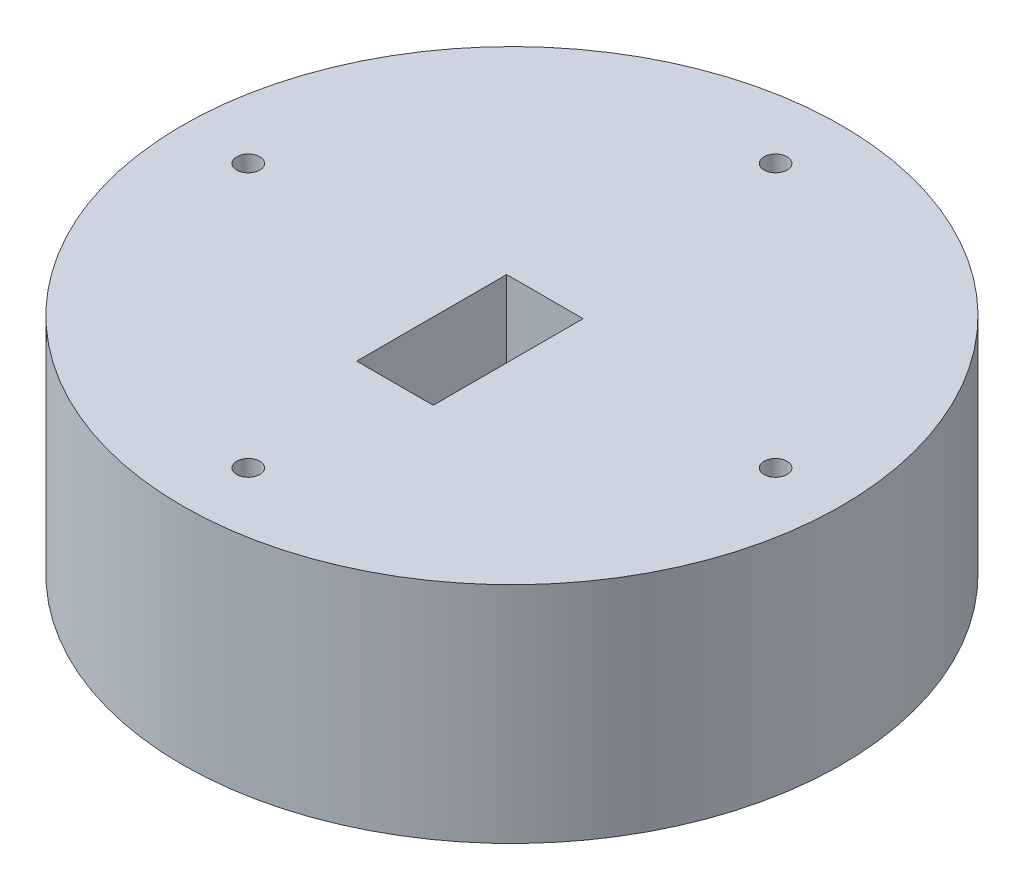
ISO-10303-21;
HEADER;
FILE_DESCRIPTION(('STEP AP214'),'2;1');
FILE_NAME('part.step','',(''),(''),'','','');
FILE_SCHEMA(('AUTOMOTIVE_DESIGN { 1 0 10303 214 1 1 1 1 }'));
ENDSEC;
DATA;
#1=APPLICATION_CONTEXT('core data for automotive mechanical design processes');
#2=APPLICATION_PROTOCOL_DEFINITION('international standard','automotive_design',2000,#1);
#3=PRODUCT_CONTEXT('',#1,'mechanical');
#4=PRODUCT('Part','Part','',(#3));
#5=PRODUCT_RELATED_PRODUCT_CATEGORY('part','',(#4));
#6=PRODUCT_DEFINITION_FORMATION('','',#4);
#7=PRODUCT_DEFINITION_CONTEXT('part definition',#1,'design');
#8=PRODUCT_DEFINITION('design','',#6,#7);
#9=PRODUCT_DEFINITION_SHAPE('','',#8);
#10=(LENGTH_UNIT() NAMED_UNIT(*) SI_UNIT(.MILLI.,.METRE.));
#11=(NAMED_UNIT(*) PLANE_ANGLE_UNIT() SI_UNIT($,.RADIAN.));
#12=(NAMED_UNIT(*) SI_UNIT($,.STERADIAN.) SOLID_ANGLE_UNIT());
#13=UNCERTAINTY_MEASURE_WITH_UNIT(LENGTH_MEASURE(1.E-05),#10,'distance_accuracy_value','');
#14=(GEOMETRIC_REPRESENTATION_CONTEXT(3) GLOBAL_UNCERTAINTY_ASSIGNED_CONTEXT((#13)) GLOBAL_UNIT_ASSIGNED_CONTEXT((#10,
#11,#12)) REPRESENTATION_CONTEXT('',''));
#15=CARTESIAN_POINT('',(0.,0.,0.));
#16=DIRECTION('',(0.,0.,1.));
#17=DIRECTION('',(1.,0.,0.));
#18=AXIS2_PLACEMENT_3D('',#15,#16,#17);
#19=CARTESIAN_POINT('',(0.,30.,0.));
#20=DIRECTION('',(0.,-1.,0.));
#21=DIRECTION('',(0.,0.,-1.));
#22=AXIS2_PLACEMENT_3D('',#19,#20,#21);
#23=CYLINDRICAL_SURFACE('',#22,50.);
#24=CARTESIAN_POINT('',(0.,0.,0.));
#25=DIRECTION('',(0.,1.,0.));
#26=DIRECTION('',(0.,0.,1.));
#27=AXIS2_PLACEMENT_3D('',#24,#25,#26);
#28=CIRCLE('',#27,50.);
#29=CARTESIAN_POINT('',(0.,0.,50.));
#30=VERTEX_POINT('',#29);
#31=EDGE_CURVE('E11',#30,#30,#28,.T.);
#32=ORIENTED_EDGE('',*,*,#31,.T.);
#33=EDGE_LOOP('',(#32));
#34=FACE_BOUND('',#33,.T.);
#35=CARTESIAN_POINT('',(0.,34.,0.));
#36=DIRECTION('',(0.,1.,0.));
#37=DIRECTION('',(0.,0.,1.));
#38=AXIS2_PLACEMENT_3D('',#35,#36,#37);
#39=CIRCLE('',#38,50.);
#40=CARTESIAN_POINT('',(0.,34.,50.));
#41=VERTEX_POINT('',#40);
#42=EDGE_CURVE('E44',#41,#41,#39,.T.);
#43=ORIENTED_EDGE('',*,*,#42,.F.);
#44=EDGE_LOOP('',(#43));
#45=FACE_BOUND('',#44,.T.);
#46=ADVANCED_FACE('F37',(#34,#45),#23,.T.);
#47=CARTESIAN_POINT('',(0.,0.,0.));
#48=DIRECTION('',(0.,1.,0.));
#49=DIRECTION('',(0.,0.,1.));
#50=AXIS2_PLACEMENT_3D('',#47,#48,#49);
#51=PLANE('',#50);
#52=CARTESIAN_POINT('',(40.,0.,0.));
#53=DIRECTION('',(0.,1.,0.));
#54=DIRECTION('',(0.,0.,1.));
#55=AXIS2_PLACEMENT_3D('',#52,#53,#54);
#56=CIRCLE('',#55,1.75000000000013);
#57=CARTESIAN_POINT('',(40.,0.,1.75000000000013));
#58=VERTEX_POINT('',#57);
#59=EDGE_CURVE('E168',#58,#58,#56,.T.);
#60=ORIENTED_EDGE('',*,*,#59,.T.);
#61=EDGE_LOOP('',(#60));
#62=FACE_BOUND('',#61,.T.);
#63=CARTESIAN_POINT('',(0.,0.,40.));
#64=DIRECTION('',(0.,1.,0.));
#65=DIRECTION('',(0.,0.,1.));
#66=AXIS2_PLACEMENT_3D('',#63,#64,#65);
#67=CIRCLE('',#66,1.75000000000027);
#68=CARTESIAN_POINT('',(0.,0.,41.7500000000003));
#69=VERTEX_POINT('',#68);
#70=EDGE_CURVE('E172',#69,#69,#67,.T.);
#71=ORIENTED_EDGE('',*,*,#70,.T.);
#72=EDGE_LOOP('',(#71));
#73=FACE_BOUND('',#72,.T.);
#74=CARTESIAN_POINT('',(-40.,0.,0.));
#75=DIRECTION('',(0.,1.,0.));
#76=DIRECTION('',(0.,0.,1.));
#77=AXIS2_PLACEMENT_3D('',#74,#75,#76);
#78=CIRCLE('',#77,1.75000000000042);
#79=CARTESIAN_POINT('',(-40.,0.,1.75000000000043));
#80=VERTEX_POINT('',#79);
#81=EDGE_CURVE('E182',#80,#80,#78,.T.);
#82=ORIENTED_EDGE('',*,*,#81,.T.);
#83=EDGE_LOOP('',(#82));
#84=FACE_BOUND('',#83,.T.);
#85=CARTESIAN_POINT('',(0.,0.,-40.));
#86=DIRECTION('',(0.,1.,0.));
#87=DIRECTION('',(0.,0.,1.));
#88=AXIS2_PLACEMENT_3D('',#85,#86,#87);
#89=CIRCLE('',#88,1.75);
#90=CARTESIAN_POINT('',(0.,0.,-38.25));
#91=VERTEX_POINT('',#90);
#92=EDGE_CURVE('E108',#91,#91,#89,.T.);
#93=ORIENTED_EDGE('',*,*,#92,.T.);
#94=EDGE_LOOP('',(#93));
#95=FACE_BOUND('',#94,.T.);
#96=ORIENTED_EDGE('',*,*,#31,.F.);
#97=EDGE_LOOP('',(#96));
#98=FACE_BOUND('',#97,.T.);
#99=ADVANCED_FACE('F121',(#62,#73,#84,#95,#98),#51,.F.);
#100=CARTESIAN_POINT('',(0.,34.,0.));
#101=DIRECTION('',(0.,1.,0.));
#102=DIRECTION('',(0.,0.,1.));
#103=AXIS2_PLACEMENT_3D('',#100,#101,#102);
#104=PLANE('',#103);
#105=CARTESIAN_POINT('',(40.,34.,0.));
#106=DIRECTION('',(0.,1.,0.));
#107=DIRECTION('',(0.,0.,1.));
#108=AXIS2_PLACEMENT_3D('',#105,#106,#107);
#109=CIRCLE('',#108,1.75000000000013);
#110=CARTESIAN_POINT('',(40.,34.,1.75000000000013));
#111=VERTEX_POINT('',#110);
#112=EDGE_CURVE('E171',#111,#111,#109,.T.);
#113=ORIENTED_EDGE('',*,*,#112,.F.);
#114=EDGE_LOOP('',(#113));
#115=FACE_BOUND('',#114,.T.);
#116=CARTESIAN_POINT('',(0.,34.,40.));
#117=DIRECTION('',(0.,1.,0.));
#118=DIRECTION('',(0.,0.,1.));
#119=AXIS2_PLACEMENT_3D('',#116,#117,#118);
#120=CIRCLE('',#119,1.75000000000027);
#121=CARTESIAN_POINT('',(0.,34.,41.7500000000003));
#122=VERTEX_POINT('',#121);
#123=EDGE_CURVE('E177',#122,#122,#120,.T.);
#124=ORIENTED_EDGE('',*,*,#123,.F.);
#125=EDGE_LOOP('',(#124));
#126=FACE_BOUND('',#125,.T.);
#127=CARTESIAN_POINT('',(-40.,34.,0.));
#128=DIRECTION('',(0.,1.,0.));
#129=DIRECTION('',(0.,0.,1.));
#130=AXIS2_PLACEMENT_3D('',#127,#128,#129);
#131=CIRCLE('',#130,1.75000000000042);
#132=CARTESIAN_POINT('',(-40.,34.,1.75000000000043));
#133=VERTEX_POINT('',#132);
#134=EDGE_CURVE('E185',#133,#133,#131,.T.);
#135=ORIENTED_EDGE('',*,*,#134,.F.);
#136=EDGE_LOOP('',(#135));
#137=FACE_BOUND('',#136,.T.);
#138=CARTESIAN_POINT('',(0.,34.,-40.));
#139=DIRECTION('',(0.,1.,0.));
#140=DIRECTION('',(0.,0.,1.));
#141=AXIS2_PLACEMENT_3D('',#138,#139,#140);
#142=CIRCLE('',#141,1.75);
#143=CARTESIAN_POINT('',(0.,34.,-38.25));
#144=VERTEX_POINT('',#143);
#145=EDGE_CURVE('E174',#144,#144,#142,.T.);
#146=ORIENTED_EDGE('',*,*,#145,.F.);
#147=EDGE_LOOP('',(#146));
#148=FACE_BOUND('',#147,.T.);
#149=DIRECTION('',(0.,0.,-1.));
#150=VECTOR('',#149,1.);
#151=CARTESIAN_POINT('',(5.79999999999999,34.,-4.99999999999999));
#152=LINE('',#151,#150);
#153=CARTESIAN_POINT('',(5.8,34.,17.75));
#154=VERTEX_POINT('',#153);
#155=CARTESIAN_POINT('',(5.79999999999999,34.,-4.99999999999999));
#156=VERTEX_POINT('',#155);
#157=EDGE_CURVE('E51',#154,#156,#152,.T.);
#158=ORIENTED_EDGE('',*,*,#157,.F.);
#159=DIRECTION('',(1.,0.,0.));
#160=VECTOR('',#159,1.);
#161=CARTESIAN_POINT('',(-5.8,34.,17.75));
#162=LINE('',#161,#160);
#163=CARTESIAN_POINT('',(-5.8,34.,17.75));
#164=VERTEX_POINT('',#163);
#165=EDGE_CURVE('E102',#164,#154,#162,.T.);
#166=ORIENTED_EDGE('',*,*,#165,.F.);
#167=DIRECTION('',(0.,0.,1.));
#168=VECTOR('',#167,1.);
#169=CARTESIAN_POINT('',(-5.8,34.,-4.99999999999999));
#170=LINE('',#169,#168);
#171=CARTESIAN_POINT('',(-5.8,34.,-4.99999999999999));
#172=VERTEX_POINT('',#171);
#173=EDGE_CURVE('E110',#172,#164,#170,.T.);
#174=ORIENTED_EDGE('',*,*,#173,.F.);
#175=DIRECTION('',(-1.,0.,0.));
#176=VECTOR('',#175,1.);
#177=CARTESIAN_POINT('',(-5.8,34.,-4.99999999999999));
#178=LINE('',#177,#176);
#179=EDGE_CURVE('E86',#156,#172,#178,.T.);
#180=ORIENTED_EDGE('',*,*,#179,.F.);
#181=EDGE_LOOP('',(#158,#166,#174,#180));
#182=FACE_BOUND('',#181,.T.);
#183=ORIENTED_EDGE('',*,*,#42,.T.);
#184=EDGE_LOOP('',(#183));
#185=FACE_BOUND('',#184,.T.);
#186=ADVANCED_FACE('F118',(#115,#126,#137,#148,#182,#185),#104,.T.);
#187=CARTESIAN_POINT('',(5.79999999999999,20.,-4.99999999999999));
#188=DIRECTION('',(1.,0.,0.));
#189=DIRECTION('',(0.,0.,-1.));
#190=AXIS2_PLACEMENT_3D('',#187,#188,#189);
#191=PLANE('',#190);
#192=ORIENTED_EDGE('',*,*,#157,.T.);
#193=DIRECTION('',(0.,1.,0.));
#194=VECTOR('',#193,1.);
#195=CARTESIAN_POINT('',(5.79999999999999,20.,-4.99999999999999));
#196=LINE('',#195,#194);
#197=CARTESIAN_POINT('',(5.79999999999999,20.,-4.99999999999999));
#198=VERTEX_POINT('',#197);
#199=EDGE_CURVE('E74',#198,#156,#196,.T.);
#200=ORIENTED_EDGE('',*,*,#199,.F.);
#201=DIRECTION('',(0.,0.,-1.));
#202=VECTOR('',#201,1.);
#203=CARTESIAN_POINT('',(5.79999999999999,20.,-4.99999999999999));
#204=LINE('',#203,#202);
#205=CARTESIAN_POINT('',(5.8,20.,17.75));
#206=VERTEX_POINT('',#205);
#207=EDGE_CURVE('E100',#206,#198,#204,.T.);
#208=ORIENTED_EDGE('',*,*,#207,.F.);
#209=DIRECTION('',(0.,1.,0.));
#210=VECTOR('',#209,1.);
#211=CARTESIAN_POINT('',(5.8,20.,17.75));
#212=LINE('',#211,#210);
#213=EDGE_CURVE('E59',#206,#154,#212,.T.);
#214=ORIENTED_EDGE('',*,*,#213,.T.);
#215=EDGE_LOOP('',(#192,#200,#208,#214));
#216=FACE_BOUND('',#215,.T.);
#217=ADVANCED_FACE('F132',(#216),#191,.F.);
#218=CARTESIAN_POINT('',(-5.8,20.,17.75));
#219=DIRECTION('',(0.,0.,1.));
#220=DIRECTION('',(1.,0.,0.));
#221=AXIS2_PLACEMENT_3D('',#218,#219,#220);
#222=PLANE('',#221);
#223=ORIENTED_EDGE('',*,*,#165,.T.);
#224=ORIENTED_EDGE('',*,*,#213,.F.);
#225=DIRECTION('',(1.,0.,0.));
#226=VECTOR('',#225,1.);
#227=CARTESIAN_POINT('',(-5.8,20.,17.75));
#228=LINE('',#227,#226);
#229=CARTESIAN_POINT('',(-5.8,20.,17.75));
#230=VERTEX_POINT('',#229);
#231=EDGE_CURVE('E97',#230,#206,#228,.T.);
#232=ORIENTED_EDGE('',*,*,#231,.F.);
#233=DIRECTION('',(0.,1.,0.));
#234=VECTOR('',#233,1.);
#235=CARTESIAN_POINT('',(-5.8,20.,17.75));
#236=LINE('',#235,#234);
#237=EDGE_CURVE('E90',#230,#164,#236,.T.);
#238=ORIENTED_EDGE('',*,*,#237,.T.);
#239=EDGE_LOOP('',(#223,#224,#232,#238));
#240=FACE_BOUND('',#239,.T.);
#241=ADVANCED_FACE('F140',(#240),#222,.F.);
#242=CARTESIAN_POINT('',(-5.8,20.,-4.99999999999999));
#243=DIRECTION('',(-1.,0.,0.));
#244=DIRECTION('',(0.,0.,1.));
#245=AXIS2_PLACEMENT_3D('',#242,#243,#244);
#246=PLANE('',#245);
#247=ORIENTED_EDGE('',*,*,#173,.T.);
#248=ORIENTED_EDGE('',*,*,#237,.F.);
#249=DIRECTION('',(0.,0.,1.));
#250=VECTOR('',#249,1.);
#251=CARTESIAN_POINT('',(-5.8,20.,-4.99999999999999));
#252=LINE('',#251,#250);
#253=CARTESIAN_POINT('',(-5.8,20.,-4.99999999999999));
#254=VERTEX_POINT('',#253);
#255=EDGE_CURVE('E93',#254,#230,#252,.T.);
#256=ORIENTED_EDGE('',*,*,#255,.F.);
#257=DIRECTION('',(0.,1.,0.));
#258=VECTOR('',#257,1.);
#259=CARTESIAN_POINT('',(-5.8,20.,-4.99999999999999));
#260=LINE('',#259,#258);
#261=EDGE_CURVE('E79',#254,#172,#260,.T.);
#262=ORIENTED_EDGE('',*,*,#261,.T.);
#263=EDGE_LOOP('',(#247,#248,#256,#262));
#264=FACE_BOUND('',#263,.T.);
#265=ADVANCED_FACE('F94',(#264),#246,.F.);
#266=CARTESIAN_POINT('',(-5.8,20.,-4.99999999999999));
#267=DIRECTION('',(0.,0.,-1.));
#268=DIRECTION('',(-1.,0.,0.));
#269=AXIS2_PLACEMENT_3D('',#266,#267,#268);
#270=PLANE('',#269);
#271=ORIENTED_EDGE('',*,*,#179,.T.);
#272=ORIENTED_EDGE('',*,*,#261,.F.);
#273=DIRECTION('',(-1.,0.,0.));
#274=VECTOR('',#273,1.);
#275=CARTESIAN_POINT('',(-5.8,20.,-4.99999999999999));
#276=LINE('',#275,#274);
#277=EDGE_CURVE('E83',#198,#254,#276,.T.);
#278=ORIENTED_EDGE('',*,*,#277,.F.);
#279=ORIENTED_EDGE('',*,*,#199,.T.);
#280=EDGE_LOOP('',(#271,#272,#278,#279));
#281=FACE_BOUND('',#280,.T.);
#282=ADVANCED_FACE('F81',(#281),#270,.F.);
#283=CARTESIAN_POINT('',(0.,20.,0.));
#284=DIRECTION('',(0.,1.,0.));
#285=DIRECTION('',(0.,0.,1.));
#286=AXIS2_PLACEMENT_3D('',#283,#284,#285);
#287=PLANE('',#286);
#288=ORIENTED_EDGE('',*,*,#207,.T.);
#289=ORIENTED_EDGE('',*,*,#277,.T.);
#290=ORIENTED_EDGE('',*,*,#255,.T.);
#291=ORIENTED_EDGE('',*,*,#231,.T.);
#292=EDGE_LOOP('',(#288,#289,#290,#291));
#293=FACE_BOUND('',#292,.T.);
#294=ADVANCED_FACE('F99',(#293),#287,.T.);
#295=CARTESIAN_POINT('',(0.,0.,-40.));
#296=DIRECTION('',(0.,1.,0.));
#297=DIRECTION('',(0.,0.,1.));
#298=AXIS2_PLACEMENT_3D('',#295,#296,#297);
#299=CYLINDRICAL_SURFACE('',#298,1.75);
#300=ORIENTED_EDGE('',*,*,#92,.F.);
#301=EDGE_LOOP('',(#300));
#302=FACE_BOUND('',#301,.T.);
#303=ORIENTED_EDGE('',*,*,#145,.T.);
#304=EDGE_LOOP('',(#303));
#305=FACE_BOUND('',#304,.T.);
#306=ADVANCED_FACE('F149',(#302,#305),#299,.F.);
#307=CARTESIAN_POINT('',(-40.,0.,0.));
#308=DIRECTION('',(0.,1.,0.));
#309=DIRECTION('',(0.,0.,1.));
#310=AXIS2_PLACEMENT_3D('',#307,#308,#309);
#311=CYLINDRICAL_SURFACE('',#310,1.75000000000042);
#312=ORIENTED_EDGE('',*,*,#81,.F.);
#313=EDGE_LOOP('',(#312));
#314=FACE_BOUND('',#313,.T.);
#315=ORIENTED_EDGE('',*,*,#134,.T.);
#316=EDGE_LOOP('',(#315));
#317=FACE_BOUND('',#316,.T.);
#318=ADVANCED_FACE('F152',(#314,#317),#311,.F.);
#319=CARTESIAN_POINT('',(0.,0.,40.));
#320=DIRECTION('',(0.,1.,0.));
#321=DIRECTION('',(0.,0.,1.));
#322=AXIS2_PLACEMENT_3D('',#319,#320,#321);
#323=CYLINDRICAL_SURFACE('',#322,1.75000000000027);
#324=ORIENTED_EDGE('',*,*,#70,.F.);
#325=EDGE_LOOP('',(#324));
#326=FACE_BOUND('',#325,.T.);
#327=ORIENTED_EDGE('',*,*,#123,.T.);
#328=EDGE_LOOP('',(#327));
#329=FACE_BOUND('',#328,.T.);
#330=ADVANCED_FACE('F156',(#326,#329),#323,.F.);
#331=CARTESIAN_POINT('',(40.,0.,0.));
#332=DIRECTION('',(0.,1.,0.));
#333=DIRECTION('',(0.,0.,1.));
#334=AXIS2_PLACEMENT_3D('',#331,#332,#333);
#335=CYLINDRICAL_SURFACE('',#334,1.75000000000013);
#336=ORIENTED_EDGE('',*,*,#59,.F.);
#337=EDGE_LOOP('',(#336));
#338=FACE_BOUND('',#337,.T.);
#339=ORIENTED_EDGE('',*,*,#112,.T.);
#340=EDGE_LOOP('',(#339));
#341=FACE_BOUND('',#340,.T.);
#342=ADVANCED_FACE('F160',(#338,#341),#335,.F.);
#343=CLOSED_SHELL('',(#46,#99,#186,#217,#241,#265,#282,#294,#306,#318,#330,#342));
#344=MANIFOLD_SOLID_BREP('B2',#343);
#345=ADVANCED_BREP_SHAPE_REPRESENTATION('',(#18,#344),#14);
#346=SHAPE_DEFINITION_REPRESENTATION(#9,#345);
ENDSEC;
END-ISO-10303-21;
